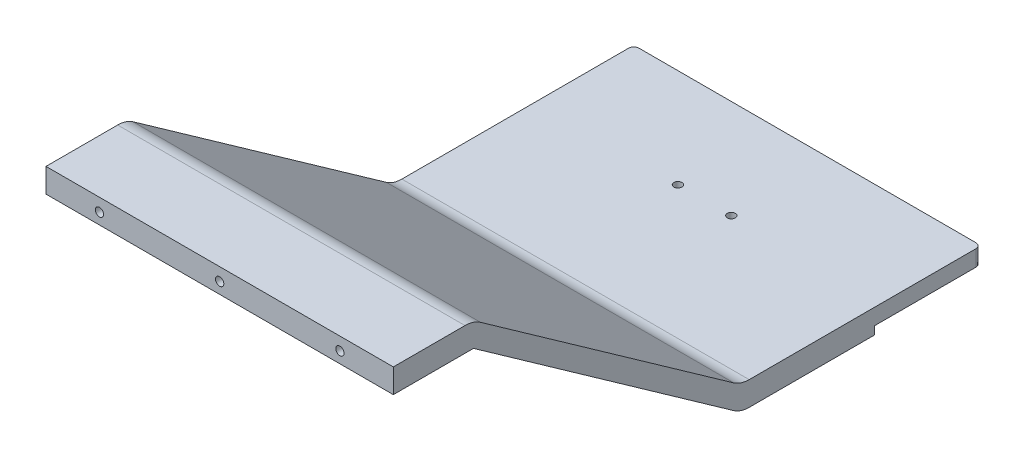
ISO-10303-21;
HEADER;
FILE_DESCRIPTION(('STEP AP214'),'2;1');
FILE_NAME('part.step','',(''),(''),'','','');
FILE_SCHEMA(('AUTOMOTIVE_DESIGN { 1 0 10303 214 1 1 1 1 }'));
ENDSEC;
DATA;
#1=APPLICATION_CONTEXT('core data for automotive mechanical design processes');
#2=APPLICATION_PROTOCOL_DEFINITION('international standard','automotive_design',2000,#1);
#3=PRODUCT_CONTEXT('',#1,'mechanical');
#4=PRODUCT('Part','Part','',(#3));
#5=PRODUCT_RELATED_PRODUCT_CATEGORY('part','',(#4));
#6=PRODUCT_DEFINITION_FORMATION('','',#4);
#7=PRODUCT_DEFINITION_CONTEXT('part definition',#1,'design');
#8=PRODUCT_DEFINITION('design','',#6,#7);
#9=PRODUCT_DEFINITION_SHAPE('','',#8);
#10=(LENGTH_UNIT() NAMED_UNIT(*) SI_UNIT(.MILLI.,.METRE.));
#11=(NAMED_UNIT(*) PLANE_ANGLE_UNIT() SI_UNIT($,.RADIAN.));
#12=(NAMED_UNIT(*) SI_UNIT($,.STERADIAN.) SOLID_ANGLE_UNIT());
#13=UNCERTAINTY_MEASURE_WITH_UNIT(LENGTH_MEASURE(1.E-05),#10,'distance_accuracy_value','');
#14=(GEOMETRIC_REPRESENTATION_CONTEXT(3) GLOBAL_UNCERTAINTY_ASSIGNED_CONTEXT((#13)) GLOBAL_UNIT_ASSIGNED_CONTEXT((#10,
#11,#12)) REPRESENTATION_CONTEXT('',''));
#15=CARTESIAN_POINT('',(0.,0.,0.));
#16=DIRECTION('',(0.,0.,1.));
#17=DIRECTION('',(1.,0.,0.));
#18=AXIS2_PLACEMENT_3D('',#15,#16,#17);
#19=CARTESIAN_POINT('',(209.,70.,-50.));
#20=DIRECTION('',(0.,0.,1.));
#21=DIRECTION('',(1.,0.,0.));
#22=AXIS2_PLACEMENT_3D('',#19,#20,#21);
#23=PLANE('',#22);
#24=DIRECTION('',(0.,1.,0.));
#25=VECTOR('',#24,1.);
#26=CARTESIAN_POINT('',(79.,70.,-50.));
#27=LINE('',#26,#25);
#28=CARTESIAN_POINT('',(79.,70.,-50.));
#29=VERTEX_POINT('',#28);
#30=CARTESIAN_POINT('',(79.,73.,-50.));
#31=VERTEX_POINT('',#30);
#32=EDGE_CURVE('E190',#29,#31,#27,.T.);
#33=ORIENTED_EDGE('',*,*,#32,.T.);
#34=DIRECTION('',(-1.,0.,0.));
#35=VECTOR('',#34,1.);
#36=CARTESIAN_POINT('',(209.,73.,-50.));
#37=LINE('',#36,#35);
#38=CARTESIAN_POINT('',(209.,73.,-50.));
#39=VERTEX_POINT('',#38);
#40=EDGE_CURVE('E252',#39,#31,#37,.T.);
#41=ORIENTED_EDGE('',*,*,#40,.F.);
#42=DIRECTION('',(0.,1.,0.));
#43=VECTOR('',#42,1.);
#44=CARTESIAN_POINT('',(209.,70.,-50.));
#45=LINE('',#44,#43);
#46=CARTESIAN_POINT('',(209.,70.,-50.));
#47=VERTEX_POINT('',#46);
#48=EDGE_CURVE('E196',#47,#39,#45,.T.);
#49=ORIENTED_EDGE('',*,*,#48,.F.);
#50=DIRECTION('',(-1.,0.,0.));
#51=VECTOR('',#50,1.);
#52=CARTESIAN_POINT('',(209.,70.,-50.));
#53=LINE('',#52,#51);
#54=EDGE_CURVE('E212',#47,#29,#53,.T.);
#55=ORIENTED_EDGE('',*,*,#54,.T.);
#56=EDGE_LOOP('',(#33,#41,#49,#55));
#57=FACE_BOUND('',#56,.T.);
#58=ADVANCED_FACE('F57',(#57),#23,.F.);
#59=CARTESIAN_POINT('',(209.,73.,-50.));
#60=DIRECTION('',(0.,1.,0.));
#61=DIRECTION('',(0.,0.,1.));
#62=AXIS2_PLACEMENT_3D('',#59,#60,#61);
#63=PLANE('',#62);
#64=CARTESIAN_POINT('',(132.5,73.,-53.));
#65=DIRECTION('',(0.,-1.,0.));
#66=DIRECTION('',(0.,0.,-1.));
#67=AXIS2_PLACEMENT_3D('',#64,#65,#66);
#68=CIRCLE('',#67,1.5);
#69=CARTESIAN_POINT('',(132.5,73.,-54.5));
#70=VERTEX_POINT('',#69);
#71=EDGE_CURVE('E278',#70,#70,#68,.T.);
#72=ORIENTED_EDGE('',*,*,#71,.F.);
#73=EDGE_LOOP('',(#72));
#74=FACE_BOUND('',#73,.T.);
#75=CARTESIAN_POINT('',(152.5,73.,-53.));
#76=DIRECTION('',(0.,-1.,0.));
#77=DIRECTION('',(0.,0.,-1.));
#78=AXIS2_PLACEMENT_3D('',#75,#76,#77);
#79=CIRCLE('',#78,1.5);
#80=CARTESIAN_POINT('',(152.5,73.,-54.5));
#81=VERTEX_POINT('',#80);
#82=EDGE_CURVE('E557',#81,#81,#79,.T.);
#83=ORIENTED_EDGE('',*,*,#82,.F.);
#84=EDGE_LOOP('',(#83));
#85=FACE_BOUND('',#84,.T.);
#86=DIRECTION('',(-1.,0.,0.));
#87=VECTOR('',#86,1.);
#88=CARTESIAN_POINT('',(209.,73.,-90.));
#89=LINE('',#88,#87);
#90=CARTESIAN_POINT('',(207.,73.,-90.));
#91=VERTEX_POINT('',#90);
#92=CARTESIAN_POINT('',(81.,73.,-90.));
#93=VERTEX_POINT('',#92);
#94=EDGE_CURVE('E247',#91,#93,#89,.T.);
#95=ORIENTED_EDGE('',*,*,#94,.F.);
#96=CARTESIAN_POINT('',(207.,73.,-88.));
#97=DIRECTION('',(0.,1.,0.));
#98=DIRECTION('',(0.,0.,1.));
#99=AXIS2_PLACEMENT_3D('',#96,#97,#98);
#100=CIRCLE('',#99,2.);
#101=CARTESIAN_POINT('',(209.,73.,-88.));
#102=VERTEX_POINT('',#101);
#103=EDGE_CURVE('E270',#91,#102,#100,.F.);
#104=ORIENTED_EDGE('',*,*,#103,.T.);
#105=DIRECTION('',(0.,0.,-1.));
#106=VECTOR('',#105,1.);
#107=CARTESIAN_POINT('',(209.,73.,-50.));
#108=LINE('',#107,#106);
#109=EDGE_CURVE('E198',#39,#102,#108,.T.);
#110=ORIENTED_EDGE('',*,*,#109,.F.);
#111=ORIENTED_EDGE('',*,*,#40,.T.);
#112=DIRECTION('',(0.,0.,-1.));
#113=VECTOR('',#112,1.);
#114=CARTESIAN_POINT('',(79.,73.,-50.));
#115=LINE('',#114,#113);
#116=CARTESIAN_POINT('',(79.,73.,-88.));
#117=VERTEX_POINT('',#116);
#118=EDGE_CURVE('E188',#31,#117,#115,.T.);
#119=ORIENTED_EDGE('',*,*,#118,.T.);
#120=CARTESIAN_POINT('',(81.,73.,-88.));
#121=DIRECTION('',(0.,1.,0.));
#122=DIRECTION('',(0.,0.,1.));
#123=AXIS2_PLACEMENT_3D('',#120,#121,#122);
#124=CIRCLE('',#123,2.);
#125=EDGE_CURVE('E269',#117,#93,#124,.F.);
#126=ORIENTED_EDGE('',*,*,#125,.T.);
#127=EDGE_LOOP('',(#95,#104,#110,#111,#119,#126));
#128=FACE_BOUND('',#127,.T.);
#129=ADVANCED_FACE('F321',(#74,#85,#128),#63,.F.);
#130=CARTESIAN_POINT('',(209.,73.,-90.));
#131=DIRECTION('',(0.,0.,1.));
#132=DIRECTION('',(1.,0.,0.));
#133=AXIS2_PLACEMENT_3D('',#130,#131,#132);
#134=PLANE('',#133);
#135=DIRECTION('',(-1.,0.,0.));
#136=VECTOR('',#135,1.);
#137=CARTESIAN_POINT('',(209.,79.,-90.));
#138=LINE('',#137,#136);
#139=CARTESIAN_POINT('',(207.,79.,-90.));
#140=VERTEX_POINT('',#139);
#141=CARTESIAN_POINT('',(81.,79.,-90.));
#142=VERTEX_POINT('',#141);
#143=EDGE_CURVE('E244',#140,#142,#138,.T.);
#144=ORIENTED_EDGE('',*,*,#143,.F.);
#145=DIRECTION('',(0.,1.,0.));
#146=VECTOR('',#145,1.);
#147=CARTESIAN_POINT('',(207.,73.,-90.));
#148=LINE('',#147,#146);
#149=EDGE_CURVE('E263',#140,#91,#148,.F.);
#150=ORIENTED_EDGE('',*,*,#149,.T.);
#151=ORIENTED_EDGE('',*,*,#94,.T.);
#152=DIRECTION('',(0.,1.,0.));
#153=VECTOR('',#152,1.);
#154=CARTESIAN_POINT('',(81.,73.,-90.));
#155=LINE('',#154,#153);
#156=EDGE_CURVE('E261',#93,#142,#155,.T.);
#157=ORIENTED_EDGE('',*,*,#156,.T.);
#158=EDGE_LOOP('',(#144,#150,#151,#157));
#159=FACE_BOUND('',#158,.T.);
#160=ADVANCED_FACE('F357',(#159),#134,.F.);
#161=CARTESIAN_POINT('',(209.,79.,-90.));
#162=DIRECTION('',(0.,-1.,0.));
#163=DIRECTION('',(0.,0.,-1.));
#164=AXIS2_PLACEMENT_3D('',#161,#162,#163);
#165=PLANE('',#164);
#166=CARTESIAN_POINT('',(132.5,79.,-53.));
#167=DIRECTION('',(0.,-1.,0.));
#168=DIRECTION('',(0.,0.,-1.));
#169=AXIS2_PLACEMENT_3D('',#166,#167,#168);
#170=CIRCLE('',#169,1.5);
#171=CARTESIAN_POINT('',(132.5,79.,-54.5));
#172=VERTEX_POINT('',#171);
#173=EDGE_CURVE('E273',#172,#172,#170,.T.);
#174=ORIENTED_EDGE('',*,*,#173,.T.);
#175=EDGE_LOOP('',(#174));
#176=FACE_BOUND('',#175,.T.);
#177=CARTESIAN_POINT('',(152.5,79.,-53.));
#178=DIRECTION('',(0.,-1.,0.));
#179=DIRECTION('',(0.,0.,-1.));
#180=AXIS2_PLACEMENT_3D('',#177,#178,#179);
#181=CIRCLE('',#180,1.5);
#182=CARTESIAN_POINT('',(152.5,79.,-54.5));
#183=VERTEX_POINT('',#182);
#184=EDGE_CURVE('E275',#183,#183,#181,.T.);
#185=ORIENTED_EDGE('',*,*,#184,.T.);
#186=EDGE_LOOP('',(#185));
#187=FACE_BOUND('',#186,.T.);
#188=DIRECTION('',(0.,0.,1.));
#189=VECTOR('',#188,1.);
#190=CARTESIAN_POINT('',(209.,79.,-90.));
#191=LINE('',#190,#189);
#192=CARTESIAN_POINT('',(209.,79.,-88.));
#193=VERTEX_POINT('',#192);
#194=CARTESIAN_POINT('',(209.,79.,-3.17837245195783));
#195=VERTEX_POINT('',#194);
#196=EDGE_CURVE('E205',#193,#195,#191,.T.);
#197=ORIENTED_EDGE('',*,*,#196,.F.);
#198=CARTESIAN_POINT('',(207.,79.,-88.));
#199=DIRECTION('',(0.,-1.,0.));
#200=DIRECTION('',(0.,0.,-1.));
#201=AXIS2_PLACEMENT_3D('',#198,#199,#200);
#202=CIRCLE('',#201,2.);
#203=EDGE_CURVE('E257',#193,#140,#202,.F.);
#204=ORIENTED_EDGE('',*,*,#203,.T.);
#205=ORIENTED_EDGE('',*,*,#143,.T.);
#206=CARTESIAN_POINT('',(81.,79.,-88.));
#207=DIRECTION('',(0.,-1.,0.));
#208=DIRECTION('',(0.,0.,-1.));
#209=AXIS2_PLACEMENT_3D('',#206,#207,#208);
#210=CIRCLE('',#209,2.);
#211=CARTESIAN_POINT('',(79.,79.,-88.));
#212=VERTEX_POINT('',#211);
#213=EDGE_CURVE('E260',#142,#212,#210,.F.);
#214=ORIENTED_EDGE('',*,*,#213,.T.);
#215=DIRECTION('',(0.,0.,1.));
#216=VECTOR('',#215,1.);
#217=CARTESIAN_POINT('',(79.,79.,-90.));
#218=LINE('',#217,#216);
#219=CARTESIAN_POINT('',(79.,79.,-3.17837245195783));
#220=VERTEX_POINT('',#219);
#221=EDGE_CURVE('E217',#212,#220,#218,.T.);
#222=ORIENTED_EDGE('',*,*,#221,.T.);
#223=DIRECTION('',(-1.,0.,0.));
#224=VECTOR('',#223,1.);
#225=CARTESIAN_POINT('',(209.,79.,-3.17837245195783));
#226=LINE('',#225,#224);
#227=EDGE_CURVE('E245',#195,#220,#226,.T.);
#228=ORIENTED_EDGE('',*,*,#227,.F.);
#229=EDGE_LOOP('',(#197,#204,#205,#214,#222,#228));
#230=FACE_BOUND('',#229,.T.);
#231=ADVANCED_FACE('F331',(#176,#187,#230),#165,.F.);
#232=CARTESIAN_POINT('',(209.,89.,-3.17837245195783));
#233=DIRECTION('',(-1.,0.,0.));
#234=DIRECTION('',(0.,0.,1.));
#235=AXIS2_PLACEMENT_3D('',#232,#233,#234);
#236=CYLINDRICAL_SURFACE('',#235,10.);
#237=CARTESIAN_POINT('',(79.,89.,-3.17837245195783));
#238=DIRECTION('',(-1.,0.,0.));
#239=DIRECTION('',(0.,0.,-1.));
#240=AXIS2_PLACEMENT_3D('',#237,#238,#239);
#241=CIRCLE('',#240,10.);
#242=CARTESIAN_POINT('',(79.,80.8350341907227,2.59513023993843));
#243=VERTEX_POINT('',#242);
#244=EDGE_CURVE('E219',#220,#243,#241,.T.);
#245=ORIENTED_EDGE('',*,*,#244,.T.);
#246=DIRECTION('',(-1.,0.,0.));
#247=VECTOR('',#246,1.);
#248=CARTESIAN_POINT('',(209.,80.8350341907227,2.59513023993843));
#249=LINE('',#248,#247);
#250=CARTESIAN_POINT('',(209.,80.8350341907227,2.59513023993843));
#251=VERTEX_POINT('',#250);
#252=EDGE_CURVE('E237',#251,#243,#249,.T.);
#253=ORIENTED_EDGE('',*,*,#252,.F.);
#254=CARTESIAN_POINT('',(209.,89.,-3.17837245195783));
#255=DIRECTION('',(-1.,0.,0.));
#256=DIRECTION('',(0.,0.,-1.));
#257=AXIS2_PLACEMENT_3D('',#254,#255,#256);
#258=CIRCLE('',#257,10.);
#259=EDGE_CURVE('E202',#195,#251,#258,.T.);
#260=ORIENTED_EDGE('',*,*,#259,.F.);
#261=ORIENTED_EDGE('',*,*,#227,.T.);
#262=EDGE_LOOP('',(#245,#253,#260,#261));
#263=FACE_BOUND('',#262,.T.);
#264=ADVANCED_FACE('F339',(#263),#236,.F.);
#265=CARTESIAN_POINT('',(209.,80.8350341907227,2.59513023993843));
#266=DIRECTION('',(0.,-0.816496580927726,0.577350269189625));
#267=DIRECTION('',(0.,-0.577350269189625,-0.816496580927726));
#268=AXIS2_PLACEMENT_3D('',#265,#266,#267);
#269=PLANE('',#268);
#270=DIRECTION('',(0.,0.577350269189625,0.816496580927726));
#271=VECTOR('',#270,1.);
#272=CARTESIAN_POINT('',(79.,80.8350341907227,2.59513023993843));
#273=LINE('',#272,#271);
#274=CARTESIAN_POINT('',(79.,147.875643927932,97.4048697600616));
#275=VERTEX_POINT('',#274);
#276=EDGE_CURVE('E221',#243,#275,#273,.T.);
#277=ORIENTED_EDGE('',*,*,#276,.T.);
#278=DIRECTION('',(-1.,0.,0.));
#279=VECTOR('',#278,1.);
#280=CARTESIAN_POINT('',(209.,147.875643927932,97.4048697600616));
#281=LINE('',#280,#279);
#282=CARTESIAN_POINT('',(209.,147.875643927932,97.4048697600616));
#283=VERTEX_POINT('',#282);
#284=EDGE_CURVE('E62',#275,#283,#281,.F.);
#285=ORIENTED_EDGE('',*,*,#284,.T.);
#286=DIRECTION('',(0.,0.577350269189625,0.816496580927726));
#287=VECTOR('',#286,1.);
#288=CARTESIAN_POINT('',(209.,80.8350341907227,2.59513023993843));
#289=LINE('',#288,#287);
#290=EDGE_CURVE('E210',#251,#283,#289,.T.);
#291=ORIENTED_EDGE('',*,*,#290,.F.);
#292=ORIENTED_EDGE('',*,*,#252,.T.);
#293=EDGE_LOOP('',(#277,#285,#291,#292));
#294=FACE_BOUND('',#293,.T.);
#295=ADVANCED_FACE('F374',(#294),#269,.F.);
#296=CARTESIAN_POINT('',(209.,140.710678118655,100.));
#297=DIRECTION('',(0.,0.816496580927727,-0.577350269189625));
#298=DIRECTION('',(0.,0.577350269189625,0.816496580927727));
#299=AXIS2_PLACEMENT_3D('',#296,#297,#298);
#300=PLANE('',#299);
#301=DIRECTION('',(0.,-0.577350269189625,-0.816496580927727));
#302=VECTOR('',#301,1.);
#303=CARTESIAN_POINT('',(79.,140.710678118655,100.));
#304=LINE('',#303,#302);
#305=CARTESIAN_POINT('',(79.,140.710678118655,100.));
#306=VERTEX_POINT('',#305);
#307=CARTESIAN_POINT('',(79.,71.8350341907228,2.59513023993842));
#308=VERTEX_POINT('',#307);
#309=EDGE_CURVE('E223',#306,#308,#304,.T.);
#310=ORIENTED_EDGE('',*,*,#309,.T.);
#311=DIRECTION('',(-1.,0.,0.));
#312=VECTOR('',#311,1.);
#313=CARTESIAN_POINT('',(209.,71.8350341907228,2.59513023993842));
#314=LINE('',#313,#312);
#315=CARTESIAN_POINT('',(209.,71.8350341907228,2.59513023993842));
#316=VERTEX_POINT('',#315);
#317=EDGE_CURVE('E234',#316,#308,#314,.T.);
#318=ORIENTED_EDGE('',*,*,#317,.F.);
#319=DIRECTION('',(0.,-0.577350269189625,-0.816496580927727));
#320=VECTOR('',#319,1.);
#321=CARTESIAN_POINT('',(209.,140.710678118655,100.));
#322=LINE('',#321,#320);
#323=CARTESIAN_POINT('',(209.,140.710678118655,100.));
#324=VERTEX_POINT('',#323);
#325=EDGE_CURVE('E209',#324,#316,#322,.T.);
#326=ORIENTED_EDGE('',*,*,#325,.F.);
#327=DIRECTION('',(-1.,0.,0.));
#328=VECTOR('',#327,1.);
#329=CARTESIAN_POINT('',(209.,140.710678118655,100.));
#330=LINE('',#329,#328);
#331=EDGE_CURVE('E240',#324,#306,#330,.T.);
#332=ORIENTED_EDGE('',*,*,#331,.T.);
#333=EDGE_LOOP('',(#310,#318,#326,#332));
#334=FACE_BOUND('',#333,.T.);
#335=ADVANCED_FACE('F304',(#334),#300,.F.);
#336=CARTESIAN_POINT('',(209.,80.,-3.17837245195782));
#337=DIRECTION('',(-1.,0.,0.));
#338=DIRECTION('',(0.,0.,1.));
#339=AXIS2_PLACEMENT_3D('',#336,#337,#338);
#340=CYLINDRICAL_SURFACE('',#339,9.99999999999999);
#341=CARTESIAN_POINT('',(79.,80.,-3.17837245195782));
#342=DIRECTION('',(1.,0.,0.));
#343=DIRECTION('',(0.,0.,-1.));
#344=AXIS2_PLACEMENT_3D('',#341,#342,#343);
#345=CIRCLE('',#344,9.99999999999999);
#346=CARTESIAN_POINT('',(79.,70.,-3.17837245195782));
#347=VERTEX_POINT('',#346);
#348=EDGE_CURVE('E228',#308,#347,#345,.T.);
#349=ORIENTED_EDGE('',*,*,#348,.T.);
#350=DIRECTION('',(-1.,0.,0.));
#351=VECTOR('',#350,1.);
#352=CARTESIAN_POINT('',(209.,70.,-3.17837245195782));
#353=LINE('',#352,#351);
#354=CARTESIAN_POINT('',(209.,70.,-3.17837245195782));
#355=VERTEX_POINT('',#354);
#356=EDGE_CURVE('E233',#355,#347,#353,.T.);
#357=ORIENTED_EDGE('',*,*,#356,.F.);
#358=CARTESIAN_POINT('',(209.,80.,-3.17837245195782));
#359=DIRECTION('',(1.,0.,0.));
#360=DIRECTION('',(0.,0.,-1.));
#361=AXIS2_PLACEMENT_3D('',#358,#359,#360);
#362=CIRCLE('',#361,9.99999999999999);
#363=EDGE_CURVE('E213',#316,#355,#362,.T.);
#364=ORIENTED_EDGE('',*,*,#363,.F.);
#365=ORIENTED_EDGE('',*,*,#317,.T.);
#366=EDGE_LOOP('',(#349,#357,#364,#365));
#367=FACE_BOUND('',#366,.T.);
#368=ADVANCED_FACE('F311',(#367),#340,.T.);
#369=CARTESIAN_POINT('',(209.,70.,-3.17837245195782));
#370=DIRECTION('',(0.,1.,0.));
#371=DIRECTION('',(0.,0.,1.));
#372=AXIS2_PLACEMENT_3D('',#369,#370,#371);
#373=PLANE('',#372);
#374=DIRECTION('',(0.,0.,-1.));
#375=VECTOR('',#374,1.);
#376=CARTESIAN_POINT('',(79.,70.,-3.17837245195782));
#377=LINE('',#376,#375);
#378=EDGE_CURVE('E199',#347,#29,#377,.T.);
#379=ORIENTED_EDGE('',*,*,#378,.T.);
#380=ORIENTED_EDGE('',*,*,#54,.F.);
#381=DIRECTION('',(0.,0.,-1.));
#382=VECTOR('',#381,1.);
#383=CARTESIAN_POINT('',(209.,70.,-3.17837245195782));
#384=LINE('',#383,#382);
#385=EDGE_CURVE('E211',#355,#47,#384,.T.);
#386=ORIENTED_EDGE('',*,*,#385,.F.);
#387=ORIENTED_EDGE('',*,*,#356,.T.);
#388=EDGE_LOOP('',(#379,#380,#386,#387));
#389=FACE_BOUND('',#388,.T.);
#390=ADVANCED_FACE('F314',(#389),#373,.F.);
#391=CARTESIAN_POINT('',(209.,89.,-3.17837245195783));
#392=DIRECTION('',(1.,0.,0.));
#393=DIRECTION('',(0.,0.,-1.));
#394=AXIS2_PLACEMENT_3D('',#391,#392,#393);
#395=PLANE('',#394);
#396=ORIENTED_EDGE('',*,*,#290,.T.);
#397=CARTESIAN_POINT('',(209.,139.710678118655,103.178372451958));
#398=DIRECTION('',(1.,0.,0.));
#399=DIRECTION('',(0.,0.,-1.));
#400=AXIS2_PLACEMENT_3D('',#397,#398,#399);
#401=CIRCLE('',#400,10.);
#402=CARTESIAN_POINT('',(209.,149.710678118655,103.178372451958));
#403=VERTEX_POINT('',#402);
#404=EDGE_CURVE('E12',#283,#403,#401,.T.);
#405=ORIENTED_EDGE('',*,*,#404,.T.);
#406=DIRECTION('',(0.,0.,-1.));
#407=VECTOR('',#406,1.);
#408=CARTESIAN_POINT('',(209.,149.710678118655,130.));
#409=LINE('',#408,#407);
#410=CARTESIAN_POINT('',(209.,149.710678118655,130.));
#411=VERTEX_POINT('',#410);
#412=EDGE_CURVE('E294',#411,#403,#409,.T.);
#413=ORIENTED_EDGE('',*,*,#412,.F.);
#414=DIRECTION('',(0.,1.,0.));
#415=VECTOR('',#414,1.);
#416=CARTESIAN_POINT('',(209.,140.710678118655,130.));
#417=LINE('',#416,#415);
#418=CARTESIAN_POINT('',(209.,140.710678118655,130.));
#419=VERTEX_POINT('',#418);
#420=EDGE_CURVE('E180',#419,#411,#417,.T.);
#421=ORIENTED_EDGE('',*,*,#420,.F.);
#422=DIRECTION('',(0.,0.,-1.));
#423=VECTOR('',#422,1.);
#424=CARTESIAN_POINT('',(209.,140.710678118655,130.));
#425=LINE('',#424,#423);
#426=EDGE_CURVE('E195',#419,#324,#425,.T.);
#427=ORIENTED_EDGE('',*,*,#426,.T.);
#428=ORIENTED_EDGE('',*,*,#325,.T.);
#429=ORIENTED_EDGE('',*,*,#363,.T.);
#430=ORIENTED_EDGE('',*,*,#385,.T.);
#431=ORIENTED_EDGE('',*,*,#48,.T.);
#432=ORIENTED_EDGE('',*,*,#109,.T.);
#433=DIRECTION('',(0.,1.,0.));
#434=VECTOR('',#433,1.);
#435=CARTESIAN_POINT('',(209.,79.,-88.));
#436=LINE('',#435,#434);
#437=EDGE_CURVE('E251',#102,#193,#436,.T.);
#438=ORIENTED_EDGE('',*,*,#437,.T.);
#439=ORIENTED_EDGE('',*,*,#196,.T.);
#440=ORIENTED_EDGE('',*,*,#259,.T.);
#441=EDGE_LOOP('',(#396,#405,#413,#421,#427,#428,#429,#430,#431,#432,#438,#439,#440));
#442=FACE_BOUND('',#441,.T.);
#443=ADVANCED_FACE('F299',(#442),#395,.T.);
#444=CARTESIAN_POINT('',(79.,89.,-3.17837245195783));
#445=DIRECTION('',(1.,0.,0.));
#446=DIRECTION('',(0.,0.,-1.));
#447=AXIS2_PLACEMENT_3D('',#444,#445,#446);
#448=PLANE('',#447);
#449=DIRECTION('',(0.,0.,-1.));
#450=VECTOR('',#449,1.);
#451=CARTESIAN_POINT('',(79.,149.710678118655,130.));
#452=LINE('',#451,#450);
#453=CARTESIAN_POINT('',(79.,149.710678118655,130.));
#454=VERTEX_POINT('',#453);
#455=CARTESIAN_POINT('',(79.,149.710678118655,103.178372451958));
#456=VERTEX_POINT('',#455);
#457=EDGE_CURVE('E164',#454,#456,#452,.T.);
#458=ORIENTED_EDGE('',*,*,#457,.T.);
#459=CARTESIAN_POINT('',(79.,139.710678118655,103.178372451958));
#460=DIRECTION('',(1.,0.,0.));
#461=DIRECTION('',(0.,0.,-1.));
#462=AXIS2_PLACEMENT_3D('',#459,#460,#461);
#463=CIRCLE('',#462,10.);
#464=EDGE_CURVE('E76',#456,#275,#463,.F.);
#465=ORIENTED_EDGE('',*,*,#464,.T.);
#466=ORIENTED_EDGE('',*,*,#276,.F.);
#467=ORIENTED_EDGE('',*,*,#244,.F.);
#468=ORIENTED_EDGE('',*,*,#221,.F.);
#469=DIRECTION('',(0.,1.,0.));
#470=VECTOR('',#469,1.);
#471=CARTESIAN_POINT('',(79.,89.,-88.));
#472=LINE('',#471,#470);
#473=EDGE_CURVE('E267',#212,#117,#472,.F.);
#474=ORIENTED_EDGE('',*,*,#473,.T.);
#475=ORIENTED_EDGE('',*,*,#118,.F.);
#476=ORIENTED_EDGE('',*,*,#32,.F.);
#477=ORIENTED_EDGE('',*,*,#378,.F.);
#478=ORIENTED_EDGE('',*,*,#348,.F.);
#479=ORIENTED_EDGE('',*,*,#309,.F.);
#480=DIRECTION('',(0.,0.,-1.));
#481=VECTOR('',#480,1.);
#482=CARTESIAN_POINT('',(79.,140.710678118655,130.));
#483=LINE('',#482,#481);
#484=CARTESIAN_POINT('',(79.,140.710678118655,130.));
#485=VERTEX_POINT('',#484);
#486=EDGE_CURVE('E166',#485,#306,#483,.T.);
#487=ORIENTED_EDGE('',*,*,#486,.F.);
#488=DIRECTION('',(0.,-1.,0.));
#489=VECTOR('',#488,1.);
#490=CARTESIAN_POINT('',(79.,149.710678118655,130.));
#491=LINE('',#490,#489);
#492=EDGE_CURVE('E163',#454,#485,#491,.T.);
#493=ORIENTED_EDGE('',*,*,#492,.F.);
#494=EDGE_LOOP('',(#458,#465,#466,#467,#468,#474,#475,#476,#477,#478,#479,#487,#493));
#495=FACE_BOUND('',#494,.T.);
#496=ADVANCED_FACE('F161',(#495),#448,.F.);
#497=CARTESIAN_POINT('',(209.,149.710678118655,130.));
#498=DIRECTION('',(0.,-1.,0.));
#499=DIRECTION('',(0.,0.,-1.));
#500=AXIS2_PLACEMENT_3D('',#497,#498,#499);
#501=PLANE('',#500);
#502=ORIENTED_EDGE('',*,*,#412,.T.);
#503=DIRECTION('',(-1.,0.,0.));
#504=VECTOR('',#503,1.);
#505=CARTESIAN_POINT('',(209.,149.710678118655,103.178372451958));
#506=LINE('',#505,#504);
#507=EDGE_CURVE('E187',#403,#456,#506,.T.);
#508=ORIENTED_EDGE('',*,*,#507,.T.);
#509=ORIENTED_EDGE('',*,*,#457,.F.);
#510=DIRECTION('',(-1.,0.,0.));
#511=VECTOR('',#510,1.);
#512=CARTESIAN_POINT('',(209.,149.710678118655,130.));
#513=LINE('',#512,#511);
#514=EDGE_CURVE('E175',#411,#454,#513,.T.);
#515=ORIENTED_EDGE('',*,*,#514,.F.);
#516=EDGE_LOOP('',(#502,#508,#509,#515));
#517=FACE_BOUND('',#516,.T.);
#518=ADVANCED_FACE('F183',(#517),#501,.F.);
#519=CARTESIAN_POINT('',(79.,140.710678118655,130.));
#520=DIRECTION('',(0.,1.,0.));
#521=DIRECTION('',(0.,0.,1.));
#522=AXIS2_PLACEMENT_3D('',#519,#520,#521);
#523=PLANE('',#522);
#524=ORIENTED_EDGE('',*,*,#331,.F.);
#525=ORIENTED_EDGE('',*,*,#426,.F.);
#526=DIRECTION('',(1.,0.,0.));
#527=VECTOR('',#526,1.);
#528=CARTESIAN_POINT('',(79.,140.710678118655,130.));
#529=LINE('',#528,#527);
#530=EDGE_CURVE('E171',#485,#419,#529,.T.);
#531=ORIENTED_EDGE('',*,*,#530,.F.);
#532=ORIENTED_EDGE('',*,*,#486,.T.);
#533=EDGE_LOOP('',(#524,#525,#531,#532));
#534=FACE_BOUND('',#533,.T.);
#535=ADVANCED_FACE('F303',(#534),#523,.F.);
#536=CARTESIAN_POINT('',(0.,0.,130.));
#537=DIRECTION('',(0.,0.,1.));
#538=DIRECTION('',(1.,0.,0.));
#539=AXIS2_PLACEMENT_3D('',#536,#537,#538);
#540=PLANE('',#539);
#541=CARTESIAN_POINT('',(99.,144.890678118655,130.));
#542=DIRECTION('',(0.,0.,1.));
#543=DIRECTION('',(1.,0.,0.));
#544=AXIS2_PLACEMENT_3D('',#541,#542,#543);
#545=CIRCLE('',#544,1.54999999999999);
#546=CARTESIAN_POINT('',(100.55,144.890678118655,130.));
#547=VERTEX_POINT('',#546);
#548=EDGE_CURVE('E555',#547,#547,#545,.T.);
#549=ORIENTED_EDGE('',*,*,#548,.F.);
#550=EDGE_LOOP('',(#549));
#551=FACE_BOUND('',#550,.T.);
#552=CARTESIAN_POINT('',(144.,144.890678118655,130.));
#553=DIRECTION('',(0.,0.,1.));
#554=DIRECTION('',(1.,0.,0.));
#555=AXIS2_PLACEMENT_3D('',#552,#553,#554);
#556=CIRCLE('',#555,1.54999999999999);
#557=CARTESIAN_POINT('',(145.55,144.890678118655,130.));
#558=VERTEX_POINT('',#557);
#559=EDGE_CURVE('E560',#558,#558,#556,.T.);
#560=ORIENTED_EDGE('',*,*,#559,.F.);
#561=EDGE_LOOP('',(#560));
#562=FACE_BOUND('',#561,.T.);
#563=CARTESIAN_POINT('',(189.,144.890678118655,130.));
#564=DIRECTION('',(0.,0.,1.));
#565=DIRECTION('',(1.,0.,0.));
#566=AXIS2_PLACEMENT_3D('',#563,#564,#565);
#567=CIRCLE('',#566,1.54999999999999);
#568=CARTESIAN_POINT('',(190.55,144.890678118655,130.));
#569=VERTEX_POINT('',#568);
#570=EDGE_CURVE('E283',#569,#569,#567,.T.);
#571=ORIENTED_EDGE('',*,*,#570,.F.);
#572=EDGE_LOOP('',(#571));
#573=FACE_BOUND('',#572,.T.);
#574=ORIENTED_EDGE('',*,*,#514,.T.);
#575=ORIENTED_EDGE('',*,*,#492,.T.);
#576=ORIENTED_EDGE('',*,*,#530,.T.);
#577=ORIENTED_EDGE('',*,*,#420,.T.);
#578=EDGE_LOOP('',(#574,#575,#576,#577));
#579=FACE_BOUND('',#578,.T.);
#580=ADVANCED_FACE('F174',(#551,#562,#573,#579),#540,.T.);
#581=CARTESIAN_POINT('',(189.,144.890678118655,125.));
#582=DIRECTION('',(0.,0.,1.));
#583=DIRECTION('',(1.,0.,0.));
#584=AXIS2_PLACEMENT_3D('',#581,#582,#583);
#585=CYLINDRICAL_SURFACE('',#584,1.54999999999999);
#586=CARTESIAN_POINT('',(189.,144.890678118655,125.));
#587=DIRECTION('',(0.,0.,1.));
#588=DIRECTION('',(1.,0.,0.));
#589=AXIS2_PLACEMENT_3D('',#586,#587,#588);
#590=CIRCLE('',#589,1.54999999999999);
#591=CARTESIAN_POINT('',(190.55,144.890678118655,125.));
#592=VERTEX_POINT('',#591);
#593=EDGE_CURVE('E277',#592,#592,#590,.T.);
#594=ORIENTED_EDGE('',*,*,#593,.F.);
#595=EDGE_LOOP('',(#594));
#596=FACE_BOUND('',#595,.T.);
#597=ORIENTED_EDGE('',*,*,#570,.T.);
#598=EDGE_LOOP('',(#597));
#599=FACE_BOUND('',#598,.T.);
#600=ADVANCED_FACE('F502',(#596,#599),#585,.F.);
#601=CARTESIAN_POINT('',(189.,144.890678118655,125.));
#602=DIRECTION('',(0.,0.,1.));
#603=DIRECTION('',(1.,0.,0.));
#604=AXIS2_PLACEMENT_3D('',#601,#602,#603);
#605=PLANE('',#604);
#606=ORIENTED_EDGE('',*,*,#593,.T.);
#607=EDGE_LOOP('',(#606));
#608=FACE_BOUND('',#607,.T.);
#609=ADVANCED_FACE('F514',(#608),#605,.T.);
#610=CARTESIAN_POINT('',(144.,144.890678118655,125.));
#611=DIRECTION('',(0.,0.,1.));
#612=DIRECTION('',(1.,0.,0.));
#613=AXIS2_PLACEMENT_3D('',#610,#611,#612);
#614=CYLINDRICAL_SURFACE('',#613,1.54999999999999);
#615=CARTESIAN_POINT('',(144.,144.890678118655,125.));
#616=DIRECTION('',(0.,0.,1.));
#617=DIRECTION('',(1.,0.,0.));
#618=AXIS2_PLACEMENT_3D('',#615,#616,#617);
#619=CIRCLE('',#618,1.54999999999999);
#620=CARTESIAN_POINT('',(145.55,144.890678118655,125.));
#621=VERTEX_POINT('',#620);
#622=EDGE_CURVE('E288',#621,#621,#619,.T.);
#623=ORIENTED_EDGE('',*,*,#622,.F.);
#624=EDGE_LOOP('',(#623));
#625=FACE_BOUND('',#624,.T.);
#626=ORIENTED_EDGE('',*,*,#559,.T.);
#627=EDGE_LOOP('',(#626));
#628=FACE_BOUND('',#627,.T.);
#629=ADVANCED_FACE('F525',(#625,#628),#614,.F.);
#630=CARTESIAN_POINT('',(144.,144.890678118655,125.));
#631=DIRECTION('',(0.,0.,1.));
#632=DIRECTION('',(1.,0.,0.));
#633=AXIS2_PLACEMENT_3D('',#630,#631,#632);
#634=PLANE('',#633);
#635=ORIENTED_EDGE('',*,*,#622,.T.);
#636=EDGE_LOOP('',(#635));
#637=FACE_BOUND('',#636,.T.);
#638=ADVANCED_FACE('F527',(#637),#634,.T.);
#639=CARTESIAN_POINT('',(99.,144.890678118655,125.));
#640=DIRECTION('',(0.,0.,1.));
#641=DIRECTION('',(1.,0.,0.));
#642=AXIS2_PLACEMENT_3D('',#639,#640,#641);
#643=CYLINDRICAL_SURFACE('',#642,1.54999999999999);
#644=CARTESIAN_POINT('',(99.,144.890678118655,125.));
#645=DIRECTION('',(0.,0.,1.));
#646=DIRECTION('',(1.,0.,0.));
#647=AXIS2_PLACEMENT_3D('',#644,#645,#646);
#648=CIRCLE('',#647,1.54999999999999);
#649=CARTESIAN_POINT('',(100.55,144.890678118655,125.));
#650=VERTEX_POINT('',#649);
#651=EDGE_CURVE('E181',#650,#650,#648,.T.);
#652=ORIENTED_EDGE('',*,*,#651,.F.);
#653=EDGE_LOOP('',(#652));
#654=FACE_BOUND('',#653,.T.);
#655=ORIENTED_EDGE('',*,*,#548,.T.);
#656=EDGE_LOOP('',(#655));
#657=FACE_BOUND('',#656,.T.);
#658=ADVANCED_FACE('F537',(#654,#657),#643,.F.);
#659=CARTESIAN_POINT('',(99.,144.890678118655,125.));
#660=DIRECTION('',(0.,0.,1.));
#661=DIRECTION('',(1.,0.,0.));
#662=AXIS2_PLACEMENT_3D('',#659,#660,#661);
#663=PLANE('',#662);
#664=ORIENTED_EDGE('',*,*,#651,.T.);
#665=EDGE_LOOP('',(#664));
#666=FACE_BOUND('',#665,.T.);
#667=ADVANCED_FACE('F364',(#666),#663,.T.);
#668=CARTESIAN_POINT('',(207.,89.,-88.));
#669=DIRECTION('',(0.,-1.,0.));
#670=DIRECTION('',(0.,0.,-1.));
#671=AXIS2_PLACEMENT_3D('',#668,#669,#670);
#672=CYLINDRICAL_SURFACE('',#671,2.);
#673=ORIENTED_EDGE('',*,*,#103,.F.);
#674=ORIENTED_EDGE('',*,*,#149,.F.);
#675=ORIENTED_EDGE('',*,*,#203,.F.);
#676=ORIENTED_EDGE('',*,*,#437,.F.);
#677=EDGE_LOOP('',(#673,#674,#675,#676));
#678=FACE_BOUND('',#677,.T.);
#679=ADVANCED_FACE('F327',(#678),#672,.T.);
#680=CARTESIAN_POINT('',(81.,73.,-88.));
#681=DIRECTION('',(0.,1.,0.));
#682=DIRECTION('',(0.,0.,1.));
#683=AXIS2_PLACEMENT_3D('',#680,#681,#682);
#684=CYLINDRICAL_SURFACE('',#683,2.);
#685=ORIENTED_EDGE('',*,*,#125,.F.);
#686=ORIENTED_EDGE('',*,*,#473,.F.);
#687=ORIENTED_EDGE('',*,*,#213,.F.);
#688=ORIENTED_EDGE('',*,*,#156,.F.);
#689=EDGE_LOOP('',(#685,#686,#687,#688));
#690=FACE_BOUND('',#689,.T.);
#691=ADVANCED_FACE('F361',(#690),#684,.T.);
#692=CARTESIAN_POINT('',(152.5,149.710678118655,-53.));
#693=DIRECTION('',(0.,-1.,0.));
#694=DIRECTION('',(0.,0.,-1.));
#695=AXIS2_PLACEMENT_3D('',#692,#693,#694);
#696=CYLINDRICAL_SURFACE('',#695,1.5);
#697=CARTESIAN_POINT('',(152.5,73.,-54.5));
#698=CARTESIAN_POINT('',(152.5,73.0625,-54.5));
#699=CARTESIAN_POINT('',(152.5,73.125,-54.5));
#700=CARTESIAN_POINT('',(152.5,73.25,-54.5));
#701=CARTESIAN_POINT('',(152.5,73.3125,-54.5));
#702=CARTESIAN_POINT('',(152.5,73.4375,-54.5));
#703=CARTESIAN_POINT('',(152.5,73.5,-54.5));
#704=CARTESIAN_POINT('',(152.5,73.625,-54.5));
#705=CARTESIAN_POINT('',(152.5,73.6875,-54.5));
#706=CARTESIAN_POINT('',(152.5,73.8125,-54.5));
#707=CARTESIAN_POINT('',(152.5,73.875,-54.5));
#708=CARTESIAN_POINT('',(152.5,74.,-54.5));
#709=CARTESIAN_POINT('',(152.5,74.0625,-54.5));
#710=CARTESIAN_POINT('',(152.5,74.1875,-54.5));
#711=CARTESIAN_POINT('',(152.5,74.25,-54.5));
#712=CARTESIAN_POINT('',(152.5,74.375,-54.5));
#713=CARTESIAN_POINT('',(152.5,74.4375,-54.5));
#714=CARTESIAN_POINT('',(152.5,74.5625,-54.5));
#715=CARTESIAN_POINT('',(152.5,74.625,-54.5));
#716=CARTESIAN_POINT('',(152.5,74.75,-54.5));
#717=CARTESIAN_POINT('',(152.5,74.8125,-54.5));
#718=CARTESIAN_POINT('',(152.5,74.9375,-54.5));
#719=CARTESIAN_POINT('',(152.5,75.,-54.5));
#720=CARTESIAN_POINT('',(152.5,75.125,-54.5));
#721=CARTESIAN_POINT('',(152.5,75.1875,-54.5));
#722=CARTESIAN_POINT('',(152.5,75.3125,-54.5));
#723=CARTESIAN_POINT('',(152.5,75.375,-54.5));
#724=CARTESIAN_POINT('',(152.5,75.5,-54.5));
#725=CARTESIAN_POINT('',(152.5,75.5625,-54.5));
#726=CARTESIAN_POINT('',(152.5,75.6875,-54.5));
#727=CARTESIAN_POINT('',(152.5,75.75,-54.5));
#728=CARTESIAN_POINT('',(152.5,75.875,-54.5));
#729=CARTESIAN_POINT('',(152.5,75.9375,-54.5));
#730=CARTESIAN_POINT('',(152.5,76.0625,-54.5));
#731=CARTESIAN_POINT('',(152.5,76.125,-54.5));
#732=CARTESIAN_POINT('',(152.5,76.25,-54.5));
#733=CARTESIAN_POINT('',(152.5,76.3125,-54.5));
#734=CARTESIAN_POINT('',(152.5,76.4375,-54.5));
#735=CARTESIAN_POINT('',(152.5,76.5,-54.5));
#736=CARTESIAN_POINT('',(152.5,76.625,-54.5));
#737=CARTESIAN_POINT('',(152.5,76.6875,-54.5));
#738=CARTESIAN_POINT('',(152.5,76.8125,-54.5));
#739=CARTESIAN_POINT('',(152.5,76.875,-54.5));
#740=CARTESIAN_POINT('',(152.5,77.,-54.5));
#741=CARTESIAN_POINT('',(152.5,77.0625,-54.5));
#742=CARTESIAN_POINT('',(152.5,77.1875,-54.5));
#743=CARTESIAN_POINT('',(152.5,77.25,-54.5));
#744=CARTESIAN_POINT('',(152.5,77.375,-54.5));
#745=CARTESIAN_POINT('',(152.5,77.4375,-54.5));
#746=CARTESIAN_POINT('',(152.5,77.5625,-54.5));
#747=CARTESIAN_POINT('',(152.5,77.625,-54.5));
#748=CARTESIAN_POINT('',(152.5,77.75,-54.5));
#749=CARTESIAN_POINT('',(152.5,77.8125,-54.5));
#750=CARTESIAN_POINT('',(152.5,77.9375,-54.5));
#751=CARTESIAN_POINT('',(152.5,78.,-54.5));
#752=CARTESIAN_POINT('',(152.5,78.125,-54.5));
#753=CARTESIAN_POINT('',(152.5,78.1875,-54.5));
#754=CARTESIAN_POINT('',(152.5,78.3125,-54.5));
#755=CARTESIAN_POINT('',(152.5,78.375,-54.5));
#756=CARTESIAN_POINT('',(152.5,78.5,-54.5));
#757=CARTESIAN_POINT('',(152.5,78.5625,-54.5));
#758=CARTESIAN_POINT('',(152.5,78.6875,-54.5));
#759=CARTESIAN_POINT('',(152.5,78.75,-54.5));
#760=CARTESIAN_POINT('',(152.5,78.875,-54.5));
#761=CARTESIAN_POINT('',(152.5,78.9375,-54.5));
#762=CARTESIAN_POINT('',(152.5,79.,-54.5));
#763=B_SPLINE_CURVE_WITH_KNOTS('',3,(#697,#698,#699,#700,#701,#702,#703,#704,#705,#706,#707,
#708,#709,#710,#711,#712,#713,#714,#715,#716,#717,#718,#719,#720,#721,#722,#723,#724,#725,#726,
#727,#728,#729,#730,#731,#732,#733,#734,#735,#736,#737,#738,#739,#740,#741,#742,#743,#744,#745,
#746,#747,#748,#749,#750,#751,#752,#753,#754,#755,#756,#757,#758,#759,#760,#761,#762),
.UNSPECIFIED.,.F.,.F.,(4,2,2,2,2,2,2,2,2,2,2,2,2,2,2,2,2,2,2,2,2,2,2,2,2,2,2,2,2,2,2,2,4),(0.,
0.187500000000007,0.375,0.562500000000007,0.750000000000001,0.937500000000008,1.125,
1.31250000000001,1.5,1.68750000000001,1.87500000000002,2.06250000000001,2.25000000000002,
2.43750000000001,2.62500000000002,2.81250000000001,3.00000000000002,3.18750000000002,
3.37500000000002,3.56250000000002,3.75000000000002,3.93750000000002,4.12500000000002,
4.31250000000002,4.50000000000003,4.68750000000002,4.87500000000003,5.06250000000002,
5.25000000000003,5.43750000000003,5.62500000000003,5.81250000000003,6.00000000000003),.UNSPECIFIED.);
#764=EDGE_CURVE('BSEAM347',#81,#183,#763,.T.);
#765=ORIENTED_EDGE('',*,*,#82,.T.);
#766=ORIENTED_EDGE('',*,*,#184,.F.);
#767=ORIENTED_EDGE('',*,*,#764,.T.);
#768=ORIENTED_EDGE('',*,*,#764,.F.);
#769=EDGE_LOOP('',(#765,#767,#766,#768));
#770=FACE_BOUND('',#769,.T.);
#771=ADVANCED_FACE('F347',(#770),#696,.F.);
#772=CARTESIAN_POINT('',(132.5,149.710678118655,-53.));
#773=DIRECTION('',(0.,-1.,0.));
#774=DIRECTION('',(0.,0.,-1.));
#775=AXIS2_PLACEMENT_3D('',#772,#773,#774);
#776=CYLINDRICAL_SURFACE('',#775,1.5);
#777=CARTESIAN_POINT('',(132.5,73.,-54.5));
#778=CARTESIAN_POINT('',(132.5,73.0625,-54.5));
#779=CARTESIAN_POINT('',(132.5,73.125,-54.5));
#780=CARTESIAN_POINT('',(132.5,73.25,-54.5));
#781=CARTESIAN_POINT('',(132.5,73.3125,-54.5));
#782=CARTESIAN_POINT('',(132.5,73.4375,-54.5));
#783=CARTESIAN_POINT('',(132.5,73.5,-54.5));
#784=CARTESIAN_POINT('',(132.5,73.625,-54.5));
#785=CARTESIAN_POINT('',(132.5,73.6875,-54.5));
#786=CARTESIAN_POINT('',(132.5,73.8125,-54.5));
#787=CARTESIAN_POINT('',(132.5,73.875,-54.5));
#788=CARTESIAN_POINT('',(132.5,74.,-54.5));
#789=CARTESIAN_POINT('',(132.5,74.0625,-54.5));
#790=CARTESIAN_POINT('',(132.5,74.1875,-54.5));
#791=CARTESIAN_POINT('',(132.5,74.25,-54.5));
#792=CARTESIAN_POINT('',(132.5,74.375,-54.5));
#793=CARTESIAN_POINT('',(132.5,74.4375,-54.5));
#794=CARTESIAN_POINT('',(132.5,74.5625,-54.5));
#795=CARTESIAN_POINT('',(132.5,74.625,-54.5));
#796=CARTESIAN_POINT('',(132.5,74.75,-54.5));
#797=CARTESIAN_POINT('',(132.5,74.8125,-54.5));
#798=CARTESIAN_POINT('',(132.5,74.9375,-54.5));
#799=CARTESIAN_POINT('',(132.5,75.,-54.5));
#800=CARTESIAN_POINT('',(132.5,75.125,-54.5));
#801=CARTESIAN_POINT('',(132.5,75.1875,-54.5));
#802=CARTESIAN_POINT('',(132.5,75.3125,-54.5));
#803=CARTESIAN_POINT('',(132.5,75.375,-54.5));
#804=CARTESIAN_POINT('',(132.5,75.5,-54.5));
#805=CARTESIAN_POINT('',(132.5,75.5625,-54.5));
#806=CARTESIAN_POINT('',(132.5,75.6875,-54.5));
#807=CARTESIAN_POINT('',(132.5,75.75,-54.5));
#808=CARTESIAN_POINT('',(132.5,75.875,-54.5));
#809=CARTESIAN_POINT('',(132.5,75.9375,-54.5));
#810=CARTESIAN_POINT('',(132.5,76.0625,-54.5));
#811=CARTESIAN_POINT('',(132.5,76.125,-54.5));
#812=CARTESIAN_POINT('',(132.5,76.25,-54.5));
#813=CARTESIAN_POINT('',(132.5,76.3125,-54.5));
#814=CARTESIAN_POINT('',(132.5,76.4375,-54.5));
#815=CARTESIAN_POINT('',(132.5,76.5,-54.5));
#816=CARTESIAN_POINT('',(132.5,76.625,-54.5));
#817=CARTESIAN_POINT('',(132.5,76.6875,-54.5));
#818=CARTESIAN_POINT('',(132.5,76.8125,-54.5));
#819=CARTESIAN_POINT('',(132.5,76.875,-54.5));
#820=CARTESIAN_POINT('',(132.5,77.,-54.5));
#821=CARTESIAN_POINT('',(132.5,77.0625,-54.5));
#822=CARTESIAN_POINT('',(132.5,77.1875,-54.5));
#823=CARTESIAN_POINT('',(132.5,77.25,-54.5));
#824=CARTESIAN_POINT('',(132.5,77.375,-54.5));
#825=CARTESIAN_POINT('',(132.5,77.4375,-54.5));
#826=CARTESIAN_POINT('',(132.5,77.5625,-54.5));
#827=CARTESIAN_POINT('',(132.5,77.625,-54.5));
#828=CARTESIAN_POINT('',(132.5,77.75,-54.5));
#829=CARTESIAN_POINT('',(132.5,77.8125,-54.5));
#830=CARTESIAN_POINT('',(132.5,77.9375,-54.5));
#831=CARTESIAN_POINT('',(132.5,78.,-54.5));
#832=CARTESIAN_POINT('',(132.5,78.125,-54.5));
#833=CARTESIAN_POINT('',(132.5,78.1875,-54.5));
#834=CARTESIAN_POINT('',(132.5,78.3125,-54.5));
#835=CARTESIAN_POINT('',(132.5,78.375,-54.5));
#836=CARTESIAN_POINT('',(132.5,78.5,-54.5));
#837=CARTESIAN_POINT('',(132.5,78.5625,-54.5));
#838=CARTESIAN_POINT('',(132.5,78.6875,-54.5));
#839=CARTESIAN_POINT('',(132.5,78.75,-54.5));
#840=CARTESIAN_POINT('',(132.5,78.875,-54.5));
#841=CARTESIAN_POINT('',(132.5,78.9375,-54.5));
#842=CARTESIAN_POINT('',(132.5,79.,-54.5));
#843=B_SPLINE_CURVE_WITH_KNOTS('',3,(#777,#778,#779,#780,#781,#782,#783,#784,#785,#786,#787,
#788,#789,#790,#791,#792,#793,#794,#795,#796,#797,#798,#799,#800,#801,#802,#803,#804,#805,#806,
#807,#808,#809,#810,#811,#812,#813,#814,#815,#816,#817,#818,#819,#820,#821,#822,#823,#824,#825,
#826,#827,#828,#829,#830,#831,#832,#833,#834,#835,#836,#837,#838,#839,#840,#841,#842),
.UNSPECIFIED.,.F.,.F.,(4,2,2,2,2,2,2,2,2,2,2,2,2,2,2,2,2,2,2,2,2,2,2,2,2,2,2,2,2,2,2,2,4),(0.,
0.187500000000007,0.375,0.562500000000007,0.750000000000001,0.937500000000008,1.125,
1.31250000000001,1.5,1.68750000000001,1.87500000000002,2.06250000000001,2.25000000000002,
2.43750000000001,2.62500000000002,2.81250000000001,3.00000000000002,3.18750000000002,
3.37500000000002,3.56250000000002,3.75000000000002,3.93750000000002,4.12500000000002,
4.31250000000002,4.50000000000003,4.68750000000002,4.87500000000003,5.06250000000002,
5.25000000000003,5.43750000000003,5.62500000000003,5.81250000000003,6.00000000000003),.UNSPECIFIED.);
#844=EDGE_CURVE('BSEAM341',#70,#172,#843,.T.);
#845=ORIENTED_EDGE('',*,*,#71,.T.);
#846=ORIENTED_EDGE('',*,*,#173,.F.);
#847=ORIENTED_EDGE('',*,*,#844,.T.);
#848=ORIENTED_EDGE('',*,*,#844,.F.);
#849=EDGE_LOOP('',(#845,#847,#846,#848));
#850=FACE_BOUND('',#849,.T.);
#851=ADVANCED_FACE('F341',(#850),#776,.F.);
#852=CARTESIAN_POINT('',(209.,139.710678118655,103.178372451958));
#853=DIRECTION('',(-1.,0.,0.));
#854=DIRECTION('',(0.,0.,1.));
#855=AXIS2_PLACEMENT_3D('',#852,#853,#854);
#856=CYLINDRICAL_SURFACE('',#855,10.);
#857=ORIENTED_EDGE('',*,*,#404,.F.);
#858=ORIENTED_EDGE('',*,*,#284,.F.);
#859=ORIENTED_EDGE('',*,*,#464,.F.);
#860=ORIENTED_EDGE('',*,*,#507,.F.);
#861=EDGE_LOOP('',(#857,#858,#859,#860));
#862=FACE_BOUND('',#861,.T.);
#863=ADVANCED_FACE('F59',(#862),#856,.T.);
#864=CLOSED_SHELL('',(#58,#129,#160,#231,#264,#295,#335,#368,#390,#443,#496,#518,#535,#580,#600,
#609,#629,#638,#658,#667,#679,#691,#771,#851,#863));
#865=MANIFOLD_SOLID_BREP('B2',#864);
#866=ADVANCED_BREP_SHAPE_REPRESENTATION('',(#18,#865),#14);
#867=SHAPE_DEFINITION_REPRESENTATION(#9,#866);
ENDSEC;
END-ISO-10303-21;
